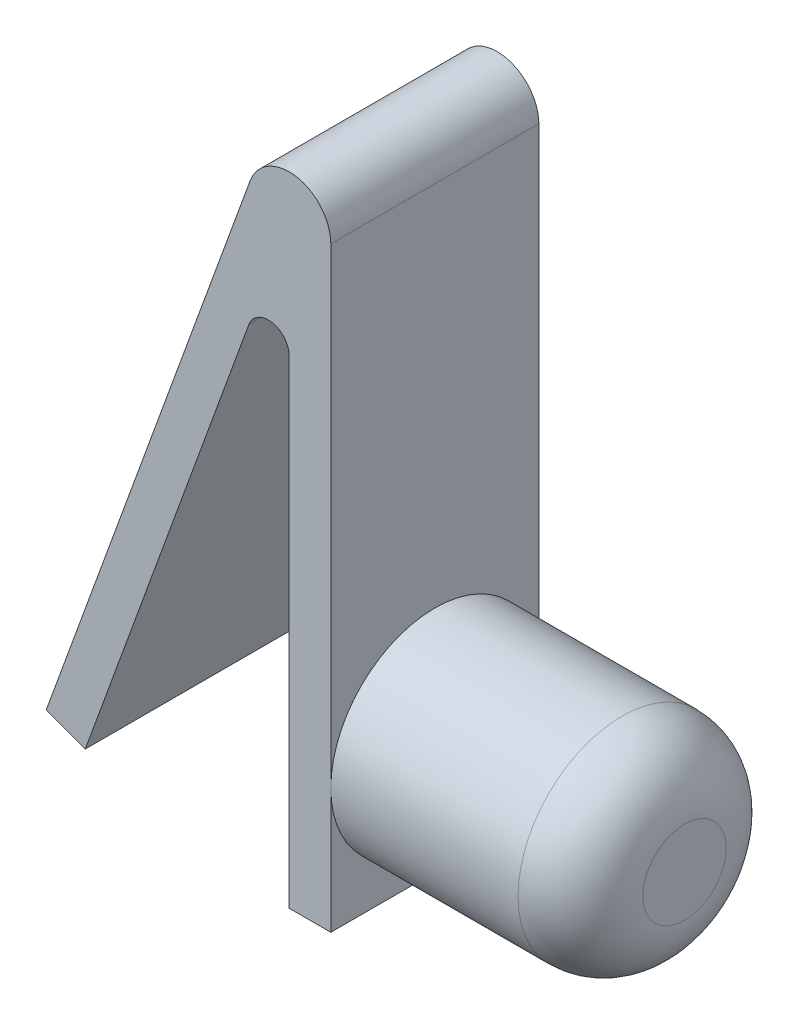
ISO-10303-21;
HEADER;
FILE_DESCRIPTION(('STEP AP214'),'2;1');
FILE_NAME('part.step','',(''),(''),'','','');
FILE_SCHEMA(('AUTOMOTIVE_DESIGN { 1 0 10303 214 1 1 1 1 }'));
ENDSEC;
DATA;
#1=APPLICATION_CONTEXT('core data for automotive mechanical design processes');
#2=APPLICATION_PROTOCOL_DEFINITION('international standard','automotive_design',2000,#1);
#3=PRODUCT_CONTEXT('',#1,'mechanical');
#4=PRODUCT('Part','Part','',(#3));
#5=PRODUCT_RELATED_PRODUCT_CATEGORY('part','',(#4));
#6=PRODUCT_DEFINITION_FORMATION('','',#4);
#7=PRODUCT_DEFINITION_CONTEXT('part definition',#1,'design');
#8=PRODUCT_DEFINITION('design','',#6,#7);
#9=PRODUCT_DEFINITION_SHAPE('','',#8);
#10=(LENGTH_UNIT() NAMED_UNIT(*) SI_UNIT(.MILLI.,.METRE.));
#11=(NAMED_UNIT(*) PLANE_ANGLE_UNIT() SI_UNIT($,.RADIAN.));
#12=(NAMED_UNIT(*) SI_UNIT($,.STERADIAN.) SOLID_ANGLE_UNIT());
#13=UNCERTAINTY_MEASURE_WITH_UNIT(LENGTH_MEASURE(1.E-05),#10,'distance_accuracy_value','');
#14=(GEOMETRIC_REPRESENTATION_CONTEXT(3) GLOBAL_UNCERTAINTY_ASSIGNED_CONTEXT((#13)) GLOBAL_UNIT_ASSIGNED_CONTEXT((#10,
#11,#12)) REPRESENTATION_CONTEXT('',''));
#15=CARTESIAN_POINT('',(0.,0.,0.));
#16=DIRECTION('',(0.,0.,1.));
#17=DIRECTION('',(1.,0.,0.));
#18=AXIS2_PLACEMENT_3D('',#15,#16,#17);
#19=CARTESIAN_POINT('',(1.,14.3287181803821,5.));
#20=DIRECTION('',(1.,0.,0.));
#21=DIRECTION('',(0.,1.,0.));
#22=AXIS2_PLACEMENT_3D('',#19,#20,#21);
#23=PLANE('',#22);
#24=DIRECTION('',(0.,-1.,0.));
#25=VECTOR('',#24,1.);
#26=CARTESIAN_POINT('',(1.,14.3287181803821,0.));
#27=LINE('',#26,#25);
#28=CARTESIAN_POINT('',(1.,3.,0.));
#29=VERTEX_POINT('',#28);
#30=CARTESIAN_POINT('',(1.,0.,0.));
#31=VERTEX_POINT('',#30);
#32=EDGE_CURVE('E165',#29,#31,#27,.T.);
#33=ORIENTED_EDGE('',*,*,#32,.F.);
#34=CARTESIAN_POINT('',(1.,3.,2.5));
#35=DIRECTION('',(1.,0.,0.));
#36=DIRECTION('',(0.,1.,0.));
#37=AXIS2_PLACEMENT_3D('',#34,#35,#36);
#38=CIRCLE('',#37,2.5);
#39=CARTESIAN_POINT('',(1.,3.,5.));
#40=VERTEX_POINT('',#39);
#41=EDGE_CURVE('E60',#40,#29,#38,.T.);
#42=ORIENTED_EDGE('',*,*,#41,.F.);
#43=DIRECTION('',(0.,-1.,0.));
#44=VECTOR('',#43,1.);
#45=CARTESIAN_POINT('',(1.,14.3287181803821,5.));
#46=LINE('',#45,#44);
#47=CARTESIAN_POINT('',(1.,0.,5.));
#48=VERTEX_POINT('',#47);
#49=EDGE_CURVE('E249',#40,#48,#46,.T.);
#50=ORIENTED_EDGE('',*,*,#49,.T.);
#51=DIRECTION('',(0.,0.,-1.));
#52=VECTOR('',#51,1.);
#53=CARTESIAN_POINT('',(1.,0.,5.));
#54=LINE('',#53,#52);
#55=EDGE_CURVE('E204',#48,#31,#54,.T.);
#56=ORIENTED_EDGE('',*,*,#55,.T.);
#57=EDGE_LOOP('',(#33,#42,#50,#56));
#58=FACE_BOUND('',#57,.T.);
#59=ADVANCED_FACE('F45',(#58),#23,.T.);
#60=CARTESIAN_POINT('',(0.,14.3287181803822,5.));
#61=DIRECTION('',(0.,0.,-1.));
#62=DIRECTION('',(-1.,0.,0.));
#63=AXIS2_PLACEMENT_3D('',#60,#61,#62);
#64=CYLINDRICAL_SURFACE('',#63,1.);
#65=CARTESIAN_POINT('',(0.,14.3287181803822,0.));
#66=DIRECTION('',(0.,0.,-1.));
#67=DIRECTION('',(-1.,0.,0.));
#68=AXIS2_PLACEMENT_3D('',#65,#66,#67);
#69=CIRCLE('',#68,1.);
#70=CARTESIAN_POINT('',(-0.93969262078595,14.6707383237077,0.));
#71=VERTEX_POINT('',#70);
#72=CARTESIAN_POINT('',(1.,14.3287181803821,0.));
#73=VERTEX_POINT('',#72);
#74=EDGE_CURVE('E161',#71,#73,#69,.T.);
#75=ORIENTED_EDGE('',*,*,#74,.F.);
#76=DIRECTION('',(0.,0.,-1.));
#77=VECTOR('',#76,1.);
#78=CARTESIAN_POINT('',(-0.93969262078595,14.6707383237077,5.));
#79=LINE('',#78,#77);
#80=CARTESIAN_POINT('',(-0.93969262078595,14.6707383237077,5.));
#81=VERTEX_POINT('',#80);
#82=EDGE_CURVE('E69',#81,#71,#79,.T.);
#83=ORIENTED_EDGE('',*,*,#82,.F.);
#84=CARTESIAN_POINT('',(0.,14.3287181803822,5.));
#85=DIRECTION('',(0.,0.,-1.));
#86=DIRECTION('',(-1.,0.,0.));
#87=AXIS2_PLACEMENT_3D('',#84,#85,#86);
#88=CIRCLE('',#87,1.);
#89=CARTESIAN_POINT('',(1.,14.3287181803821,5.));
#90=VERTEX_POINT('',#89);
#91=EDGE_CURVE('E191',#81,#90,#88,.T.);
#92=ORIENTED_EDGE('',*,*,#91,.T.);
#93=DIRECTION('',(0.,0.,-1.));
#94=VECTOR('',#93,1.);
#95=CARTESIAN_POINT('',(1.,14.3287181803821,5.));
#96=LINE('',#95,#94);
#97=EDGE_CURVE('E108',#90,#73,#96,.T.);
#98=ORIENTED_EDGE('',*,*,#97,.T.);
#99=EDGE_LOOP('',(#75,#83,#92,#98));
#100=FACE_BOUND('',#99,.T.);
#101=ADVANCED_FACE('F224',(#100),#64,.T.);
#102=CARTESIAN_POINT('',(-5.84040286651326,1.20614758428179,5.));
#103=DIRECTION('',(-0.93969262078591,0.342020143325663,0.));
#104=DIRECTION('',(-0.342020143325663,-0.939692620785911,0.));
#105=AXIS2_PLACEMENT_3D('',#102,#103,#104);
#106=PLANE('',#105);
#107=DIRECTION('',(0.342020143325663,0.939692620785911,0.));
#108=VECTOR('',#107,1.);
#109=CARTESIAN_POINT('',(-5.84040286651326,1.20614758428179,0.));
#110=LINE('',#109,#108);
#111=CARTESIAN_POINT('',(-5.84040286651326,1.20614758428179,0.));
#112=VERTEX_POINT('',#111);
#113=EDGE_CURVE('E187',#112,#71,#110,.T.);
#114=ORIENTED_EDGE('',*,*,#113,.F.);
#115=DIRECTION('',(0.,0.,-1.));
#116=VECTOR('',#115,1.);
#117=CARTESIAN_POINT('',(-5.84040286651326,1.20614758428179,5.));
#118=LINE('',#117,#116);
#119=CARTESIAN_POINT('',(-5.84040286651326,1.20614758428179,5.));
#120=VERTEX_POINT('',#119);
#121=EDGE_CURVE('E138',#120,#112,#118,.T.);
#122=ORIENTED_EDGE('',*,*,#121,.F.);
#123=DIRECTION('',(0.342020143325663,0.939692620785911,0.));
#124=VECTOR('',#123,1.);
#125=CARTESIAN_POINT('',(-5.84040286651326,1.20614758428179,5.));
#126=LINE('',#125,#124);
#127=EDGE_CURVE('E147',#120,#81,#126,.T.);
#128=ORIENTED_EDGE('',*,*,#127,.T.);
#129=ORIENTED_EDGE('',*,*,#82,.T.);
#130=EDGE_LOOP('',(#114,#122,#128,#129));
#131=FACE_BOUND('',#130,.T.);
#132=ADVANCED_FACE('F231',(#131),#106,.T.);
#133=CARTESIAN_POINT('',(-4.90071024572735,0.864127440956127,5.));
#134=DIRECTION('',(-0.342020143325664,-0.93969262078591,0.));
#135=DIRECTION('',(0.93969262078591,-0.342020143325664,0.));
#136=AXIS2_PLACEMENT_3D('',#133,#134,#135);
#137=PLANE('',#136);
#138=DIRECTION('',(-0.93969262078591,0.342020143325664,0.));
#139=VECTOR('',#138,1.);
#140=CARTESIAN_POINT('',(-4.90071024572735,0.864127440956127,0.));
#141=LINE('',#140,#139);
#142=CARTESIAN_POINT('',(-4.90071024572735,0.864127440956127,0.));
#143=VERTEX_POINT('',#142);
#144=EDGE_CURVE('E132',#143,#112,#141,.T.);
#145=ORIENTED_EDGE('',*,*,#144,.F.);
#146=DIRECTION('',(0.,0.,-1.));
#147=VECTOR('',#146,1.);
#148=CARTESIAN_POINT('',(-4.90071024572735,0.864127440956127,5.));
#149=LINE('',#148,#147);
#150=CARTESIAN_POINT('',(-4.90071024572735,0.864127440956127,5.));
#151=VERTEX_POINT('',#150);
#152=EDGE_CURVE('E126',#151,#143,#149,.T.);
#153=ORIENTED_EDGE('',*,*,#152,.F.);
#154=DIRECTION('',(-0.93969262078591,0.342020143325664,0.));
#155=VECTOR('',#154,1.);
#156=CARTESIAN_POINT('',(-4.90071024572735,0.864127440956127,5.));
#157=LINE('',#156,#155);
#158=EDGE_CURVE('E129',#151,#120,#157,.T.);
#159=ORIENTED_EDGE('',*,*,#158,.T.);
#160=ORIENTED_EDGE('',*,*,#121,.T.);
#161=EDGE_LOOP('',(#145,#153,#159,#160));
#162=FACE_BOUND('',#161,.T.);
#163=ADVANCED_FACE('F128',(#162),#137,.T.);
#164=CARTESIAN_POINT('',(-0.969846310392974,11.6640873422361,5.));
#165=DIRECTION('',(0.93969262078591,-0.342020143325663,0.));
#166=DIRECTION('',(0.342020143325663,0.939692620785911,0.));
#167=AXIS2_PLACEMENT_3D('',#164,#165,#166);
#168=PLANE('',#167);
#169=DIRECTION('',(-0.342020143325663,-0.93969262078591,0.));
#170=VECTOR('',#169,1.);
#171=CARTESIAN_POINT('',(-0.969846310392974,11.6640873422361,0.));
#172=LINE('',#171,#170);
#173=CARTESIAN_POINT('',(-0.969846310392974,11.6640873422361,0.));
#174=VERTEX_POINT('',#173);
#175=EDGE_CURVE('E182',#174,#143,#172,.T.);
#176=ORIENTED_EDGE('',*,*,#175,.F.);
#177=DIRECTION('',(0.,0.,-1.));
#178=VECTOR('',#177,1.);
#179=CARTESIAN_POINT('',(-0.969846310392974,11.6640873422361,5.));
#180=LINE('',#179,#178);
#181=CARTESIAN_POINT('',(-0.969846310392974,11.6640873422361,5.));
#182=VERTEX_POINT('',#181);
#183=EDGE_CURVE('E139',#182,#174,#180,.T.);
#184=ORIENTED_EDGE('',*,*,#183,.F.);
#185=DIRECTION('',(-0.342020143325663,-0.93969262078591,0.));
#186=VECTOR('',#185,1.);
#187=CARTESIAN_POINT('',(-0.969846310392974,11.6640873422361,5.));
#188=LINE('',#187,#186);
#189=EDGE_CURVE('E145',#182,#151,#188,.T.);
#190=ORIENTED_EDGE('',*,*,#189,.T.);
#191=ORIENTED_EDGE('',*,*,#152,.T.);
#192=EDGE_LOOP('',(#176,#184,#190,#191));
#193=FACE_BOUND('',#192,.T.);
#194=ADVANCED_FACE('F150',(#193),#168,.T.);
#195=CARTESIAN_POINT('',(-0.499999999999999,11.4930772705733,5.));
#196=DIRECTION('',(0.,0.,-1.));
#197=DIRECTION('',(-1.,0.,0.));
#198=AXIS2_PLACEMENT_3D('',#195,#196,#197);
#199=CYLINDRICAL_SURFACE('',#198,0.5);
#200=CARTESIAN_POINT('',(-0.499999999999999,11.4930772705733,0.));
#201=DIRECTION('',(0.,0.,1.));
#202=DIRECTION('',(1.,0.,0.));
#203=AXIS2_PLACEMENT_3D('',#200,#201,#202);
#204=CIRCLE('',#203,0.5);
#205=CARTESIAN_POINT('',(0.,11.4930772705732,0.));
#206=VERTEX_POINT('',#205);
#207=EDGE_CURVE('E178',#206,#174,#204,.T.);
#208=ORIENTED_EDGE('',*,*,#207,.F.);
#209=DIRECTION('',(0.,0.,-1.));
#210=VECTOR('',#209,1.);
#211=CARTESIAN_POINT('',(0.,11.4930772705732,5.));
#212=LINE('',#211,#210);
#213=CARTESIAN_POINT('',(0.,11.4930772705732,5.));
#214=VERTEX_POINT('',#213);
#215=EDGE_CURVE('E198',#214,#206,#212,.T.);
#216=ORIENTED_EDGE('',*,*,#215,.F.);
#217=CARTESIAN_POINT('',(-0.499999999999999,11.4930772705733,5.));
#218=DIRECTION('',(0.,0.,1.));
#219=DIRECTION('',(1.,0.,0.));
#220=AXIS2_PLACEMENT_3D('',#217,#218,#219);
#221=CIRCLE('',#220,0.5);
#222=EDGE_CURVE('E152',#214,#182,#221,.T.);
#223=ORIENTED_EDGE('',*,*,#222,.T.);
#224=ORIENTED_EDGE('',*,*,#183,.T.);
#225=EDGE_LOOP('',(#208,#216,#223,#224));
#226=FACE_BOUND('',#225,.T.);
#227=ADVANCED_FACE('F283',(#226),#199,.F.);
#228=CARTESIAN_POINT('',(0.,0.,5.));
#229=DIRECTION('',(-1.,0.,0.));
#230=DIRECTION('',(0.,0.,1.));
#231=AXIS2_PLACEMENT_3D('',#228,#229,#230);
#232=PLANE('',#231);
#233=DIRECTION('',(0.,1.,0.));
#234=VECTOR('',#233,1.);
#235=CARTESIAN_POINT('',(0.,0.,0.));
#236=LINE('',#235,#234);
#237=CARTESIAN_POINT('',(0.,0.,0.));
#238=VERTEX_POINT('',#237);
#239=EDGE_CURVE('E174',#238,#206,#236,.T.);
#240=ORIENTED_EDGE('',*,*,#239,.F.);
#241=DIRECTION('',(0.,0.,-1.));
#242=VECTOR('',#241,1.);
#243=CARTESIAN_POINT('',(0.,0.,5.));
#244=LINE('',#243,#242);
#245=CARTESIAN_POINT('',(0.,0.,5.));
#246=VERTEX_POINT('',#245);
#247=EDGE_CURVE('E201',#246,#238,#244,.T.);
#248=ORIENTED_EDGE('',*,*,#247,.F.);
#249=DIRECTION('',(0.,1.,0.));
#250=VECTOR('',#249,1.);
#251=CARTESIAN_POINT('',(0.,0.,5.));
#252=LINE('',#251,#250);
#253=EDGE_CURVE('E155',#246,#214,#252,.T.);
#254=ORIENTED_EDGE('',*,*,#253,.T.);
#255=ORIENTED_EDGE('',*,*,#215,.T.);
#256=EDGE_LOOP('',(#240,#248,#254,#255));
#257=FACE_BOUND('',#256,.T.);
#258=ADVANCED_FACE('F242',(#257),#232,.T.);
#259=CARTESIAN_POINT('',(1.,0.,5.));
#260=DIRECTION('',(0.,-1.,0.));
#261=DIRECTION('',(0.,0.,-1.));
#262=AXIS2_PLACEMENT_3D('',#259,#260,#261);
#263=PLANE('',#262);
#264=DIRECTION('',(-1.,0.,0.));
#265=VECTOR('',#264,1.);
#266=CARTESIAN_POINT('',(1.,0.,0.));
#267=LINE('',#266,#265);
#268=EDGE_CURVE('E170',#31,#238,#267,.T.);
#269=ORIENTED_EDGE('',*,*,#268,.F.);
#270=ORIENTED_EDGE('',*,*,#55,.F.);
#271=DIRECTION('',(-1.,0.,0.));
#272=VECTOR('',#271,1.);
#273=CARTESIAN_POINT('',(1.,0.,5.));
#274=LINE('',#273,#272);
#275=EDGE_CURVE('E248',#48,#246,#274,.T.);
#276=ORIENTED_EDGE('',*,*,#275,.T.);
#277=ORIENTED_EDGE('',*,*,#247,.T.);
#278=EDGE_LOOP('',(#269,#270,#276,#277));
#279=FACE_BOUND('',#278,.T.);
#280=ADVANCED_FACE('F235',(#279),#263,.T.);
#281=EDGE_CURVE('E244',#90,#40,#46,.T.);
#282=ORIENTED_EDGE('',*,*,#281,.T.);
#283=EDGE_CURVE('E245',#29,#40,#38,.T.);
#284=ORIENTED_EDGE('',*,*,#283,.F.);
#285=EDGE_CURVE('E166',#73,#29,#27,.T.);
#286=ORIENTED_EDGE('',*,*,#285,.F.);
#287=ORIENTED_EDGE('',*,*,#97,.F.);
#288=EDGE_LOOP('',(#282,#284,#286,#287));
#289=FACE_BOUND('',#288,.T.);
#290=ADVANCED_FACE('F227',(#289),#23,.T.);
#291=CARTESIAN_POINT('',(0.,14.3287181803822,5.));
#292=DIRECTION('',(0.,0.,-1.));
#293=DIRECTION('',(-1.,0.,0.));
#294=AXIS2_PLACEMENT_3D('',#291,#292,#293);
#295=PLANE('',#294);
#296=ORIENTED_EDGE('',*,*,#91,.F.);
#297=ORIENTED_EDGE('',*,*,#127,.F.);
#298=ORIENTED_EDGE('',*,*,#158,.F.);
#299=ORIENTED_EDGE('',*,*,#189,.F.);
#300=ORIENTED_EDGE('',*,*,#222,.F.);
#301=ORIENTED_EDGE('',*,*,#253,.F.);
#302=ORIENTED_EDGE('',*,*,#275,.F.);
#303=ORIENTED_EDGE('',*,*,#49,.F.);
#304=ORIENTED_EDGE('',*,*,#281,.F.);
#305=EDGE_LOOP('',(#296,#297,#298,#299,#300,#301,#302,#303,#304));
#306=FACE_BOUND('',#305,.T.);
#307=ADVANCED_FACE('F143',(#306),#295,.F.);
#308=CARTESIAN_POINT('',(0.,14.3287181803822,0.));
#309=DIRECTION('',(0.,0.,-1.));
#310=DIRECTION('',(-1.,0.,0.));
#311=AXIS2_PLACEMENT_3D('',#308,#309,#310);
#312=PLANE('',#311);
#313=ORIENTED_EDGE('',*,*,#74,.T.);
#314=ORIENTED_EDGE('',*,*,#285,.T.);
#315=ORIENTED_EDGE('',*,*,#32,.T.);
#316=ORIENTED_EDGE('',*,*,#268,.T.);
#317=ORIENTED_EDGE('',*,*,#239,.T.);
#318=ORIENTED_EDGE('',*,*,#207,.T.);
#319=ORIENTED_EDGE('',*,*,#175,.T.);
#320=ORIENTED_EDGE('',*,*,#144,.T.);
#321=ORIENTED_EDGE('',*,*,#113,.T.);
#322=EDGE_LOOP('',(#313,#314,#315,#316,#317,#318,#319,#320,#321));
#323=FACE_BOUND('',#322,.T.);
#324=ADVANCED_FACE('F240',(#323),#312,.T.);
#325=CARTESIAN_POINT('',(7.,3.,2.5));
#326=DIRECTION('',(-1.,0.,0.));
#327=DIRECTION('',(0.,-1.,0.));
#328=AXIS2_PLACEMENT_3D('',#325,#326,#327);
#329=CYLINDRICAL_SURFACE('',#328,2.5);
#330=CARTESIAN_POINT('',(5.5,3.,2.5));
#331=DIRECTION('',(1.,0.,0.));
#332=DIRECTION('',(0.,1.,0.));
#333=AXIS2_PLACEMENT_3D('',#330,#331,#332);
#334=CIRCLE('',#333,2.5);
#335=CARTESIAN_POINT('',(5.5,5.5,2.5));
#336=VERTEX_POINT('',#335);
#337=EDGE_CURVE('E11',#336,#336,#334,.F.);
#338=ORIENTED_EDGE('',*,*,#337,.T.);
#339=EDGE_LOOP('',(#338));
#340=FACE_BOUND('',#339,.T.);
#341=ORIENTED_EDGE('',*,*,#41,.T.);
#342=ORIENTED_EDGE('',*,*,#283,.T.);
#343=EDGE_LOOP('',(#341,#342));
#344=FACE_BOUND('',#343,.T.);
#345=ADVANCED_FACE('F220',(#340,#344),#329,.T.);
#346=CARTESIAN_POINT('',(7.,0.,0.));
#347=DIRECTION('',(1.,0.,0.));
#348=DIRECTION('',(0.,1.,0.));
#349=AXIS2_PLACEMENT_3D('',#346,#347,#348);
#350=PLANE('',#349);
#351=CARTESIAN_POINT('',(7.,3.,2.5));
#352=DIRECTION('',(1.,0.,0.));
#353=DIRECTION('',(0.,1.,0.));
#354=AXIS2_PLACEMENT_3D('',#351,#352,#353);
#355=CIRCLE('',#354,1.);
#356=CARTESIAN_POINT('',(7.,4.,2.5));
#357=VERTEX_POINT('',#356);
#358=EDGE_CURVE('E54',#357,#357,#355,.T.);
#359=ORIENTED_EDGE('',*,*,#358,.T.);
#360=EDGE_LOOP('',(#359));
#361=FACE_BOUND('',#360,.T.);
#362=ADVANCED_FACE('F213',(#361),#350,.T.);
#363=CARTESIAN_POINT('',(5.5,3.,2.5));
#364=DIRECTION('',(1.,0.,0.));
#365=DIRECTION('',(0.,1.,0.));
#366=AXIS2_PLACEMENT_3D('',#363,#364,#365);
#367=DEGENERATE_TOROIDAL_SURFACE('',#366,1.,1.5,.T.);
#368=ORIENTED_EDGE('',*,*,#337,.F.);
#369=EDGE_LOOP('',(#368));
#370=FACE_BOUND('',#369,.T.);
#371=ORIENTED_EDGE('',*,*,#358,.F.);
#372=EDGE_LOOP('',(#371));
#373=FACE_BOUND('',#372,.T.);
#374=ADVANCED_FACE('F47',(#370,#373),#367,.T.);
#375=CLOSED_SHELL('',(#59,#101,#132,#163,#194,#227,#258,#280,#290,#307,#324,#345,#362,#374));
#376=MANIFOLD_SOLID_BREP('B2',#375);
#377=ADVANCED_BREP_SHAPE_REPRESENTATION('',(#18,#376),#14);
#378=SHAPE_DEFINITION_REPRESENTATION(#9,#377);
ENDSEC;
END-ISO-10303-21;
